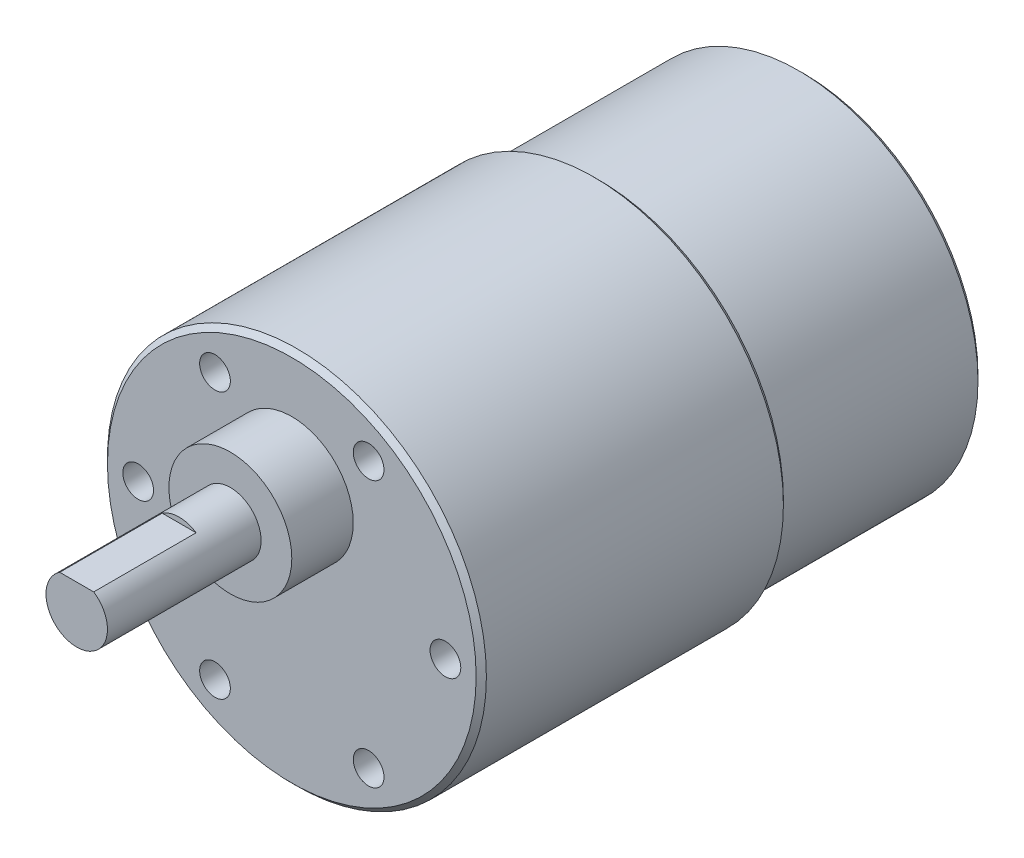
ISO-10303-21;
HEADER;
FILE_DESCRIPTION(('STEP AP214'),'2;1');
FILE_NAME('part.step','',(''),(''),'','','');
FILE_SCHEMA(('AUTOMOTIVE_DESIGN { 1 0 10303 214 1 1 1 1 }'));
ENDSEC;
DATA;
#1=APPLICATION_CONTEXT('core data for automotive mechanical design processes');
#2=APPLICATION_PROTOCOL_DEFINITION('international standard','automotive_design',2000,#1);
#3=PRODUCT_CONTEXT('',#1,'mechanical');
#4=PRODUCT('Part','Part','',(#3));
#5=PRODUCT_RELATED_PRODUCT_CATEGORY('part','',(#4));
#6=PRODUCT_DEFINITION_FORMATION('','',#4);
#7=PRODUCT_DEFINITION_CONTEXT('part definition',#1,'design');
#8=PRODUCT_DEFINITION('design','',#6,#7);
#9=PRODUCT_DEFINITION_SHAPE('','',#8);
#10=(LENGTH_UNIT() NAMED_UNIT(*) SI_UNIT(.MILLI.,.METRE.));
#11=(NAMED_UNIT(*) PLANE_ANGLE_UNIT() SI_UNIT($,.RADIAN.));
#12=(NAMED_UNIT(*) SI_UNIT($,.STERADIAN.) SOLID_ANGLE_UNIT());
#13=UNCERTAINTY_MEASURE_WITH_UNIT(LENGTH_MEASURE(1.E-05),#10,'distance_accuracy_value','');
#14=(GEOMETRIC_REPRESENTATION_CONTEXT(3) GLOBAL_UNCERTAINTY_ASSIGNED_CONTEXT((#13)) GLOBAL_UNIT_ASSIGNED_CONTEXT((#10,
#11,#12)) REPRESENTATION_CONTEXT('',''));
#15=CARTESIAN_POINT('',(0.,0.,0.));
#16=DIRECTION('',(0.,0.,1.));
#17=DIRECTION('',(1.,0.,0.));
#18=AXIS2_PLACEMENT_3D('',#15,#16,#17);
#19=CARTESIAN_POINT('',(0.,0.,-50.));
#20=DIRECTION('',(0.,0.,1.));
#21=DIRECTION('',(1.,0.,0.));
#22=AXIS2_PLACEMENT_3D('',#19,#20,#21);
#23=CYLINDRICAL_SURFACE('',#22,18.5);
#24=CARTESIAN_POINT('',(0.,0.,-29.5));
#25=DIRECTION('',(0.,0.,1.));
#26=DIRECTION('',(1.,0.,0.));
#27=AXIS2_PLACEMENT_3D('',#24,#25,#26);
#28=CIRCLE('',#27,18.5);
#29=CARTESIAN_POINT('',(18.5,0.,-29.5));
#30=VERTEX_POINT('',#29);
#31=EDGE_CURVE('E111',#30,#30,#28,.T.);
#32=ORIENTED_EDGE('',*,*,#31,.T.);
#33=EDGE_LOOP('',(#32));
#34=FACE_BOUND('',#33,.T.);
#35=CARTESIAN_POINT('',(0.,0.,-0.499999999999994));
#36=DIRECTION('',(0.,0.,1.));
#37=DIRECTION('',(1.,0.,0.));
#38=AXIS2_PLACEMENT_3D('',#35,#36,#37);
#39=CIRCLE('',#38,18.5);
#40=CARTESIAN_POINT('',(18.5,0.,-0.499999999999994));
#41=VERTEX_POINT('',#40);
#42=EDGE_CURVE('E108',#41,#41,#39,.F.);
#43=ORIENTED_EDGE('',*,*,#42,.T.);
#44=EDGE_LOOP('',(#43));
#45=FACE_BOUND('',#44,.T.);
#46=ADVANCED_FACE('F47',(#34,#45),#23,.T.);
#47=CARTESIAN_POINT('',(0.,0.,0.));
#48=DIRECTION('',(0.,0.,1.));
#49=DIRECTION('',(1.,0.,0.));
#50=AXIS2_PLACEMENT_3D('',#47,#48,#49);
#51=PLANE('',#50);
#52=CARTESIAN_POINT('',(15.,0.,0.));
#53=DIRECTION('',(0.,0.,1.));
#54=DIRECTION('',(1.,0.,0.));
#55=AXIS2_PLACEMENT_3D('',#52,#53,#54);
#56=CIRCLE('',#55,1.5);
#57=CARTESIAN_POINT('',(16.5,0.,0.));
#58=VERTEX_POINT('',#57);
#59=EDGE_CURVE('E258',#58,#58,#56,.T.);
#60=ORIENTED_EDGE('',*,*,#59,.F.);
#61=EDGE_LOOP('',(#60));
#62=FACE_BOUND('',#61,.T.);
#63=CARTESIAN_POINT('',(7.49999999999999,12.9903810567666,0.));
#64=DIRECTION('',(0.,0.,1.));
#65=DIRECTION('',(1.,0.,0.));
#66=AXIS2_PLACEMENT_3D('',#63,#64,#65);
#67=CIRCLE('',#66,1.5);
#68=CARTESIAN_POINT('',(8.99999999999999,12.9903810567666,0.));
#69=VERTEX_POINT('',#68);
#70=EDGE_CURVE('E268',#69,#69,#67,.T.);
#71=ORIENTED_EDGE('',*,*,#70,.F.);
#72=EDGE_LOOP('',(#71));
#73=FACE_BOUND('',#72,.T.);
#74=CARTESIAN_POINT('',(-7.50000000000001,12.9903810567666,0.));
#75=DIRECTION('',(0.,0.,1.));
#76=DIRECTION('',(1.,0.,0.));
#77=AXIS2_PLACEMENT_3D('',#74,#75,#76);
#78=CIRCLE('',#77,1.5);
#79=CARTESIAN_POINT('',(-6.00000000000001,12.9903810567666,0.));
#80=VERTEX_POINT('',#79);
#81=EDGE_CURVE('E267',#80,#80,#78,.T.);
#82=ORIENTED_EDGE('',*,*,#81,.F.);
#83=EDGE_LOOP('',(#82));
#84=FACE_BOUND('',#83,.T.);
#85=CARTESIAN_POINT('',(-15.,0.,0.));
#86=DIRECTION('',(0.,0.,1.));
#87=DIRECTION('',(1.,0.,0.));
#88=AXIS2_PLACEMENT_3D('',#85,#86,#87);
#89=CIRCLE('',#88,1.5);
#90=CARTESIAN_POINT('',(-13.5,0.,0.));
#91=VERTEX_POINT('',#90);
#92=EDGE_CURVE('E285',#91,#91,#89,.T.);
#93=ORIENTED_EDGE('',*,*,#92,.F.);
#94=EDGE_LOOP('',(#93));
#95=FACE_BOUND('',#94,.T.);
#96=CARTESIAN_POINT('',(-7.5,-12.9903810567666,0.));
#97=DIRECTION('',(0.,0.,1.));
#98=DIRECTION('',(1.,0.,0.));
#99=AXIS2_PLACEMENT_3D('',#96,#97,#98);
#100=CIRCLE('',#99,1.5);
#101=CARTESIAN_POINT('',(-5.99999999999999,-12.9903810567666,0.));
#102=VERTEX_POINT('',#101);
#103=EDGE_CURVE('E279',#102,#102,#100,.T.);
#104=ORIENTED_EDGE('',*,*,#103,.F.);
#105=EDGE_LOOP('',(#104));
#106=FACE_BOUND('',#105,.T.);
#107=CARTESIAN_POINT('',(7.5,-12.9903810567666,0.));
#108=DIRECTION('',(0.,0.,1.));
#109=DIRECTION('',(1.,0.,0.));
#110=AXIS2_PLACEMENT_3D('',#107,#108,#109);
#111=CIRCLE('',#110,1.5);
#112=CARTESIAN_POINT('',(9.00000000000001,-12.9903810567666,0.));
#113=VERTEX_POINT('',#112);
#114=EDGE_CURVE('E273',#113,#113,#111,.T.);
#115=ORIENTED_EDGE('',*,*,#114,.F.);
#116=EDGE_LOOP('',(#115));
#117=FACE_BOUND('',#116,.T.);
#118=CARTESIAN_POINT('',(0.,0.,0.));
#119=DIRECTION('',(0.,0.,1.));
#120=DIRECTION('',(1.,0.,0.));
#121=AXIS2_PLACEMENT_3D('',#118,#119,#120);
#122=CIRCLE('',#121,18.);
#123=CARTESIAN_POINT('',(18.,0.,0.));
#124=VERTEX_POINT('',#123);
#125=EDGE_CURVE('E12',#124,#124,#122,.T.);
#126=ORIENTED_EDGE('',*,*,#125,.T.);
#127=EDGE_LOOP('',(#126));
#128=FACE_BOUND('',#127,.T.);
#129=CARTESIAN_POINT('',(0.,7.,0.));
#130=DIRECTION('',(0.,0.,1.));
#131=DIRECTION('',(1.,0.,0.));
#132=AXIS2_PLACEMENT_3D('',#129,#130,#131);
#133=CIRCLE('',#132,6.);
#134=CARTESIAN_POINT('',(6.,7.,0.));
#135=VERTEX_POINT('',#134);
#136=EDGE_CURVE('E143',#135,#135,#133,.T.);
#137=ORIENTED_EDGE('',*,*,#136,.F.);
#138=EDGE_LOOP('',(#137));
#139=FACE_BOUND('',#138,.T.);
#140=ADVANCED_FACE('F127',(#62,#73,#84,#95,#106,#117,#128,#139),#51,.T.);
#141=CARTESIAN_POINT('',(0.,7.,6.));
#142=DIRECTION('',(0.,0.,-1.));
#143=DIRECTION('',(-1.,0.,0.));
#144=AXIS2_PLACEMENT_3D('',#141,#142,#143);
#145=CYLINDRICAL_SURFACE('',#144,6.);
#146=CARTESIAN_POINT('',(0.,7.,6.));
#147=DIRECTION('',(0.,0.,1.));
#148=DIRECTION('',(1.,0.,0.));
#149=AXIS2_PLACEMENT_3D('',#146,#147,#148);
#150=CIRCLE('',#149,6.);
#151=CARTESIAN_POINT('',(6.,7.,6.));
#152=VERTEX_POINT('',#151);
#153=EDGE_CURVE('E96',#152,#152,#150,.T.);
#154=ORIENTED_EDGE('',*,*,#153,.F.);
#155=EDGE_LOOP('',(#154));
#156=FACE_BOUND('',#155,.T.);
#157=ORIENTED_EDGE('',*,*,#136,.T.);
#158=EDGE_LOOP('',(#157));
#159=FACE_BOUND('',#158,.T.);
#160=ADVANCED_FACE('F138',(#156,#159),#145,.T.);
#161=CARTESIAN_POINT('',(0.,7.,6.));
#162=DIRECTION('',(0.,0.,1.));
#163=DIRECTION('',(1.,0.,0.));
#164=AXIS2_PLACEMENT_3D('',#161,#162,#163);
#165=PLANE('',#164);
#166=CARTESIAN_POINT('',(0.,7.,6.));
#167=DIRECTION('',(0.,0.,1.));
#168=DIRECTION('',(1.,0.,0.));
#169=AXIS2_PLACEMENT_3D('',#166,#167,#168);
#170=CIRCLE('',#169,3.);
#171=CARTESIAN_POINT('',(3.,7.,6.));
#172=VERTEX_POINT('',#171);
#173=EDGE_CURVE('E79',#172,#172,#170,.T.);
#174=ORIENTED_EDGE('',*,*,#173,.F.);
#175=EDGE_LOOP('',(#174));
#176=FACE_BOUND('',#175,.T.);
#177=ORIENTED_EDGE('',*,*,#153,.T.);
#178=EDGE_LOOP('',(#177));
#179=FACE_BOUND('',#178,.T.);
#180=ADVANCED_FACE('F158',(#176,#179),#165,.T.);
#181=CARTESIAN_POINT('',(0.,0.,11.));
#182=DIRECTION('',(0.,0.,1.));
#183=DIRECTION('',(1.,0.,0.));
#184=AXIS2_PLACEMENT_3D('',#181,#182,#183);
#185=PLANE('',#184);
#186=CARTESIAN_POINT('',(0.,7.,11.));
#187=DIRECTION('',(0.,0.,1.));
#188=DIRECTION('',(1.,0.,0.));
#189=AXIS2_PLACEMENT_3D('',#186,#187,#188);
#190=CIRCLE('',#189,3.);
#191=CARTESIAN_POINT('',(1.6583123951777,9.5,11.));
#192=VERTEX_POINT('',#191);
#193=CARTESIAN_POINT('',(-1.6583123951777,9.5,11.));
#194=VERTEX_POINT('',#193);
#195=EDGE_CURVE('E78',#192,#194,#190,.T.);
#196=ORIENTED_EDGE('',*,*,#195,.T.);
#197=DIRECTION('',(1.,0.,0.));
#198=VECTOR('',#197,1.);
#199=CARTESIAN_POINT('',(0.,9.5,11.));
#200=LINE('',#199,#198);
#201=EDGE_CURVE('E154',#194,#192,#200,.T.);
#202=ORIENTED_EDGE('',*,*,#201,.T.);
#203=EDGE_LOOP('',(#196,#202));
#204=FACE_BOUND('',#203,.T.);
#205=ADVANCED_FACE('F156',(#204),#185,.T.);
#206=CARTESIAN_POINT('',(0.,9.5,11.));
#207=DIRECTION('',(0.,-1.,0.));
#208=DIRECTION('',(0.,0.,-1.));
#209=AXIS2_PLACEMENT_3D('',#206,#207,#208);
#210=PLANE('',#209);
#211=DIRECTION('',(1.,0.,0.));
#212=VECTOR('',#211,1.);
#213=CARTESIAN_POINT('',(0.,9.5,21.));
#214=LINE('',#213,#212);
#215=CARTESIAN_POINT('',(-1.6583123951777,9.5,21.));
#216=VERTEX_POINT('',#215);
#217=CARTESIAN_POINT('',(1.6583123951777,9.5,21.));
#218=VERTEX_POINT('',#217);
#219=EDGE_CURVE('E73',#216,#218,#214,.T.);
#220=ORIENTED_EDGE('',*,*,#219,.T.);
#221=DIRECTION('',(0.,0.,1.));
#222=VECTOR('',#221,1.);
#223=CARTESIAN_POINT('',(1.6583123951777,9.5,11.));
#224=LINE('',#223,#222);
#225=EDGE_CURVE('E68',#192,#218,#224,.T.);
#226=ORIENTED_EDGE('',*,*,#225,.F.);
#227=ORIENTED_EDGE('',*,*,#201,.F.);
#228=DIRECTION('',(0.,0.,1.));
#229=VECTOR('',#228,1.);
#230=CARTESIAN_POINT('',(-1.6583123951777,9.5,11.));
#231=LINE('',#230,#229);
#232=EDGE_CURVE('E62',#194,#216,#231,.T.);
#233=ORIENTED_EDGE('',*,*,#232,.T.);
#234=EDGE_LOOP('',(#220,#226,#227,#233));
#235=FACE_BOUND('',#234,.T.);
#236=ADVANCED_FACE('F74',(#235),#210,.F.);
#237=CARTESIAN_POINT('',(0.,0.,21.));
#238=DIRECTION('',(0.,0.,1.));
#239=DIRECTION('',(1.,0.,0.));
#240=AXIS2_PLACEMENT_3D('',#237,#238,#239);
#241=PLANE('',#240);
#242=ORIENTED_EDGE('',*,*,#219,.F.);
#243=CARTESIAN_POINT('',(0.,7.,21.));
#244=DIRECTION('',(0.,0.,1.));
#245=DIRECTION('',(1.,0.,0.));
#246=AXIS2_PLACEMENT_3D('',#243,#244,#245);
#247=CIRCLE('',#246,3.);
#248=EDGE_CURVE('E84',#216,#218,#247,.T.);
#249=ORIENTED_EDGE('',*,*,#248,.T.);
#250=EDGE_LOOP('',(#242,#249));
#251=FACE_BOUND('',#250,.T.);
#252=ADVANCED_FACE('F86',(#251),#241,.T.);
#253=CARTESIAN_POINT('',(0.,7.,21.));
#254=DIRECTION('',(0.,0.,-1.));
#255=DIRECTION('',(-1.,0.,0.));
#256=AXIS2_PLACEMENT_3D('',#253,#254,#255);
#257=CYLINDRICAL_SURFACE('',#256,3.);
#258=ORIENTED_EDGE('',*,*,#173,.T.);
#259=EDGE_LOOP('',(#258));
#260=FACE_BOUND('',#259,.T.);
#261=ORIENTED_EDGE('',*,*,#248,.F.);
#262=ORIENTED_EDGE('',*,*,#232,.F.);
#263=ORIENTED_EDGE('',*,*,#195,.F.);
#264=ORIENTED_EDGE('',*,*,#225,.T.);
#265=EDGE_LOOP('',(#261,#262,#263,#264));
#266=FACE_BOUND('',#265,.T.);
#267=ADVANCED_FACE('F83',(#260,#266),#257,.T.);
#268=CARTESIAN_POINT('',(0.,0.,-30.));
#269=DIRECTION('',(0.,0.,1.));
#270=DIRECTION('',(1.,0.,0.));
#271=AXIS2_PLACEMENT_3D('',#268,#269,#270);
#272=PLANE('',#271);
#273=CARTESIAN_POINT('',(0.,0.,-30.));
#274=DIRECTION('',(0.,0.,1.));
#275=DIRECTION('',(1.,0.,0.));
#276=AXIS2_PLACEMENT_3D('',#273,#274,#275);
#277=CIRCLE('',#276,18.);
#278=CARTESIAN_POINT('',(18.,0.,-30.));
#279=VERTEX_POINT('',#278);
#280=EDGE_CURVE('E55',#279,#279,#277,.F.);
#281=ORIENTED_EDGE('',*,*,#280,.T.);
#282=EDGE_LOOP('',(#281));
#283=FACE_BOUND('',#282,.T.);
#284=CARTESIAN_POINT('',(0.,0.,-30.));
#285=DIRECTION('',(0.,0.,1.));
#286=DIRECTION('',(1.,0.,0.));
#287=AXIS2_PLACEMENT_3D('',#284,#285,#286);
#288=CIRCLE('',#287,17.5);
#289=CARTESIAN_POINT('',(17.5,0.,-30.));
#290=VERTEX_POINT('',#289);
#291=EDGE_CURVE('E145',#290,#290,#288,.T.);
#292=ORIENTED_EDGE('',*,*,#291,.T.);
#293=EDGE_LOOP('',(#292));
#294=FACE_BOUND('',#293,.T.);
#295=ADVANCED_FACE('F116',(#283,#294),#272,.F.);
#296=CARTESIAN_POINT('',(0.,0.,-30.));
#297=DIRECTION('',(0.,0.,-1.));
#298=DIRECTION('',(-1.,0.,0.));
#299=AXIS2_PLACEMENT_3D('',#296,#297,#298);
#300=CYLINDRICAL_SURFACE('',#299,17.5);
#301=CARTESIAN_POINT('',(0.,0.,-49.5));
#302=DIRECTION('',(0.,0.,1.));
#303=DIRECTION('',(1.,0.,0.));
#304=AXIS2_PLACEMENT_3D('',#301,#302,#303);
#305=CIRCLE('',#304,17.5);
#306=CARTESIAN_POINT('',(17.5,0.,-49.5));
#307=VERTEX_POINT('',#306);
#308=EDGE_CURVE('E102',#307,#307,#305,.T.);
#309=ORIENTED_EDGE('',*,*,#308,.T.);
#310=EDGE_LOOP('',(#309));
#311=FACE_BOUND('',#310,.T.);
#312=ORIENTED_EDGE('',*,*,#291,.F.);
#313=EDGE_LOOP('',(#312));
#314=FACE_BOUND('',#313,.T.);
#315=ADVANCED_FACE('F178',(#311,#314),#300,.T.);
#316=CARTESIAN_POINT('',(0.,0.,-56.));
#317=DIRECTION('',(0.,0.,-1.));
#318=DIRECTION('',(-1.,0.,0.));
#319=AXIS2_PLACEMENT_3D('',#316,#317,#318);
#320=PLANE('',#319);
#321=CARTESIAN_POINT('',(0.,0.,-56.));
#322=DIRECTION('',(0.,0.,-1.));
#323=DIRECTION('',(-1.,0.,0.));
#324=AXIS2_PLACEMENT_3D('',#321,#322,#323);
#325=CIRCLE('',#324,4.50000000000002);
#326=CARTESIAN_POINT('',(-4.50000000000002,0.,-56.));
#327=VERTEX_POINT('',#326);
#328=EDGE_CURVE('E90',#327,#327,#325,.T.);
#329=ORIENTED_EDGE('',*,*,#328,.T.);
#330=EDGE_LOOP('',(#329));
#331=FACE_BOUND('',#330,.T.);
#332=ADVANCED_FACE('F174',(#331),#320,.T.);
#333=CARTESIAN_POINT('',(0.,0.,-56.));
#334=DIRECTION('',(0.,0.,1.));
#335=DIRECTION('',(1.,0.,0.));
#336=AXIS2_PLACEMENT_3D('',#333,#334,#335);
#337=CYLINDRICAL_SURFACE('',#336,5.);
#338=CARTESIAN_POINT('',(0.,0.,-55.5));
#339=DIRECTION('',(0.,0.,-1.));
#340=DIRECTION('',(-1.,0.,0.));
#341=AXIS2_PLACEMENT_3D('',#338,#339,#340);
#342=CIRCLE('',#341,5.);
#343=CARTESIAN_POINT('',(-5.,0.,-55.5));
#344=VERTEX_POINT('',#343);
#345=EDGE_CURVE('E99',#344,#344,#342,.F.);
#346=ORIENTED_EDGE('',*,*,#345,.T.);
#347=EDGE_LOOP('',(#346));
#348=FACE_BOUND('',#347,.T.);
#349=CARTESIAN_POINT('',(0.,0.,-50.));
#350=DIRECTION('',(0.,0.,-1.));
#351=DIRECTION('',(-1.,0.,0.));
#352=AXIS2_PLACEMENT_3D('',#349,#350,#351);
#353=CIRCLE('',#352,5.);
#354=CARTESIAN_POINT('',(-5.,0.,-50.));
#355=VERTEX_POINT('',#354);
#356=EDGE_CURVE('E87',#355,#355,#353,.T.);
#357=ORIENTED_EDGE('',*,*,#356,.T.);
#358=EDGE_LOOP('',(#357));
#359=FACE_BOUND('',#358,.T.);
#360=ADVANCED_FACE('F177',(#348,#359),#337,.T.);
#361=CARTESIAN_POINT('',(0.,0.,-50.));
#362=DIRECTION('',(0.,0.,1.));
#363=DIRECTION('',(1.,0.,0.));
#364=AXIS2_PLACEMENT_3D('',#361,#362,#363);
#365=PLANE('',#364);
#366=CARTESIAN_POINT('',(0.,0.,-50.));
#367=DIRECTION('',(0.,0.,1.));
#368=DIRECTION('',(1.,0.,0.));
#369=AXIS2_PLACEMENT_3D('',#366,#367,#368);
#370=CIRCLE('',#369,17.);
#371=CARTESIAN_POINT('',(17.,0.,-50.));
#372=VERTEX_POINT('',#371);
#373=EDGE_CURVE('E105',#372,#372,#370,.F.);
#374=ORIENTED_EDGE('',*,*,#373,.T.);
#375=EDGE_LOOP('',(#374));
#376=FACE_BOUND('',#375,.T.);
#377=ORIENTED_EDGE('',*,*,#356,.F.);
#378=EDGE_LOOP('',(#377));
#379=FACE_BOUND('',#378,.T.);
#380=ADVANCED_FACE('F182',(#376,#379),#365,.F.);
#381=CARTESIAN_POINT('',(0.,0.,-56.));
#382=DIRECTION('',(0.,0.,1.));
#383=DIRECTION('',(1.,0.,0.));
#384=AXIS2_PLACEMENT_3D('',#381,#382,#383);
#385=CONICAL_SURFACE('',#384,4.50000000000002,0.785398163397444);
#386=ORIENTED_EDGE('',*,*,#345,.F.);
#387=EDGE_LOOP('',(#386));
#388=FACE_BOUND('',#387,.T.);
#389=ORIENTED_EDGE('',*,*,#328,.F.);
#390=EDGE_LOOP('',(#389));
#391=FACE_BOUND('',#390,.T.);
#392=ADVANCED_FACE('F185',(#388,#391),#385,.T.);
#393=CARTESIAN_POINT('',(0.,0.,-49.5));
#394=DIRECTION('',(0.,0.,1.));
#395=DIRECTION('',(1.,0.,0.));
#396=AXIS2_PLACEMENT_3D('',#393,#394,#395);
#397=CONICAL_SURFACE('',#396,17.5,0.785398163397452);
#398=ORIENTED_EDGE('',*,*,#373,.F.);
#399=EDGE_LOOP('',(#398));
#400=FACE_BOUND('',#399,.T.);
#401=ORIENTED_EDGE('',*,*,#308,.F.);
#402=EDGE_LOOP('',(#401));
#403=FACE_BOUND('',#402,.T.);
#404=ADVANCED_FACE('F122',(#400,#403),#397,.T.);
#405=CARTESIAN_POINT('',(0.,0.,-29.5));
#406=DIRECTION('',(0.,0.,1.));
#407=DIRECTION('',(1.,0.,0.));
#408=AXIS2_PLACEMENT_3D('',#405,#406,#407);
#409=CONICAL_SURFACE('',#408,18.5,0.785398163397459);
#410=ORIENTED_EDGE('',*,*,#280,.F.);
#411=EDGE_LOOP('',(#410));
#412=FACE_BOUND('',#411,.T.);
#413=ORIENTED_EDGE('',*,*,#31,.F.);
#414=EDGE_LOOP('',(#413));
#415=FACE_BOUND('',#414,.T.);
#416=ADVANCED_FACE('F119',(#412,#415),#409,.T.);
#417=CARTESIAN_POINT('',(0.,0.,0.));
#418=DIRECTION('',(0.,0.,-1.));
#419=DIRECTION('',(-1.,0.,0.));
#420=AXIS2_PLACEMENT_3D('',#417,#418,#419);
#421=CONICAL_SURFACE('',#420,18.,0.785398163397424);
#422=ORIENTED_EDGE('',*,*,#42,.F.);
#423=EDGE_LOOP('',(#422));
#424=FACE_BOUND('',#423,.T.);
#425=ORIENTED_EDGE('',*,*,#125,.F.);
#426=EDGE_LOOP('',(#425));
#427=FACE_BOUND('',#426,.T.);
#428=ADVANCED_FACE('F49',(#424,#427),#421,.T.);
#429=CARTESIAN_POINT('',(7.5,-12.9903810567666,-10.));
#430=DIRECTION('',(0.,0.,1.));
#431=DIRECTION('',(1.,0.,0.));
#432=AXIS2_PLACEMENT_3D('',#429,#430,#431);
#433=CYLINDRICAL_SURFACE('',#432,1.5);
#434=CARTESIAN_POINT('',(7.5,-12.9903810567666,-10.));
#435=DIRECTION('',(0.,0.,1.));
#436=DIRECTION('',(1.,0.,0.));
#437=AXIS2_PLACEMENT_3D('',#434,#435,#436);
#438=CIRCLE('',#437,1.5);
#439=CARTESIAN_POINT('',(9.00000000000001,-12.9903810567666,-10.));
#440=VERTEX_POINT('',#439);
#441=EDGE_CURVE('E261',#440,#440,#438,.T.);
#442=ORIENTED_EDGE('',*,*,#441,.F.);
#443=EDGE_LOOP('',(#442));
#444=FACE_BOUND('',#443,.T.);
#445=ORIENTED_EDGE('',*,*,#114,.T.);
#446=EDGE_LOOP('',(#445));
#447=FACE_BOUND('',#446,.T.);
#448=ADVANCED_FACE('F133',(#444,#447),#433,.F.);
#449=CARTESIAN_POINT('',(7.5,-12.9903810567666,-10.));
#450=DIRECTION('',(0.,0.,1.));
#451=DIRECTION('',(1.,0.,0.));
#452=AXIS2_PLACEMENT_3D('',#449,#450,#451);
#453=PLANE('',#452);
#454=ORIENTED_EDGE('',*,*,#441,.T.);
#455=EDGE_LOOP('',(#454));
#456=FACE_BOUND('',#455,.T.);
#457=ADVANCED_FACE('F229',(#456),#453,.T.);
#458=CARTESIAN_POINT('',(-7.5,-12.9903810567666,-10.));
#459=DIRECTION('',(0.,0.,1.));
#460=DIRECTION('',(1.,0.,0.));
#461=AXIS2_PLACEMENT_3D('',#458,#459,#460);
#462=CYLINDRICAL_SURFACE('',#461,1.5);
#463=CARTESIAN_POINT('',(-7.5,-12.9903810567666,-10.));
#464=DIRECTION('',(0.,0.,1.));
#465=DIRECTION('',(1.,0.,0.));
#466=AXIS2_PLACEMENT_3D('',#463,#464,#465);
#467=CIRCLE('',#466,1.5);
#468=CARTESIAN_POINT('',(-5.99999999999999,-12.9903810567666,-10.));
#469=VERTEX_POINT('',#468);
#470=EDGE_CURVE('E276',#469,#469,#467,.T.);
#471=ORIENTED_EDGE('',*,*,#470,.F.);
#472=EDGE_LOOP('',(#471));
#473=FACE_BOUND('',#472,.T.);
#474=ORIENTED_EDGE('',*,*,#103,.T.);
#475=EDGE_LOOP('',(#474));
#476=FACE_BOUND('',#475,.T.);
#477=ADVANCED_FACE('F226',(#473,#476),#462,.F.);
#478=CARTESIAN_POINT('',(-7.5,-12.9903810567666,-10.));
#479=DIRECTION('',(0.,0.,1.));
#480=DIRECTION('',(1.,0.,0.));
#481=AXIS2_PLACEMENT_3D('',#478,#479,#480);
#482=PLANE('',#481);
#483=ORIENTED_EDGE('',*,*,#470,.T.);
#484=EDGE_LOOP('',(#483));
#485=FACE_BOUND('',#484,.T.);
#486=ADVANCED_FACE('F221',(#485),#482,.T.);
#487=CARTESIAN_POINT('',(-15.,0.,-10.));
#488=DIRECTION('',(0.,0.,1.));
#489=DIRECTION('',(1.,0.,0.));
#490=AXIS2_PLACEMENT_3D('',#487,#488,#489);
#491=CYLINDRICAL_SURFACE('',#490,1.5);
#492=CARTESIAN_POINT('',(-15.,0.,-10.));
#493=DIRECTION('',(0.,0.,1.));
#494=DIRECTION('',(1.,0.,0.));
#495=AXIS2_PLACEMENT_3D('',#492,#493,#494);
#496=CIRCLE('',#495,1.5);
#497=CARTESIAN_POINT('',(-13.5,0.,-10.));
#498=VERTEX_POINT('',#497);
#499=EDGE_CURVE('E282',#498,#498,#496,.T.);
#500=ORIENTED_EDGE('',*,*,#499,.F.);
#501=EDGE_LOOP('',(#500));
#502=FACE_BOUND('',#501,.T.);
#503=ORIENTED_EDGE('',*,*,#92,.T.);
#504=EDGE_LOOP('',(#503));
#505=FACE_BOUND('',#504,.T.);
#506=ADVANCED_FACE('F218',(#502,#505),#491,.F.);
#507=CARTESIAN_POINT('',(-15.,0.,-10.));
#508=DIRECTION('',(0.,0.,1.));
#509=DIRECTION('',(1.,0.,0.));
#510=AXIS2_PLACEMENT_3D('',#507,#508,#509);
#511=PLANE('',#510);
#512=ORIENTED_EDGE('',*,*,#499,.T.);
#513=EDGE_LOOP('',(#512));
#514=FACE_BOUND('',#513,.T.);
#515=ADVANCED_FACE('F212',(#514),#511,.T.);
#516=CARTESIAN_POINT('',(-7.50000000000001,12.9903810567666,-10.));
#517=DIRECTION('',(0.,0.,1.));
#518=DIRECTION('',(1.,0.,0.));
#519=AXIS2_PLACEMENT_3D('',#516,#517,#518);
#520=CYLINDRICAL_SURFACE('',#519,1.5);
#521=CARTESIAN_POINT('',(-7.50000000000001,12.9903810567666,-10.));
#522=DIRECTION('',(0.,0.,1.));
#523=DIRECTION('',(1.,0.,0.));
#524=AXIS2_PLACEMENT_3D('',#521,#522,#523);
#525=CIRCLE('',#524,1.5);
#526=CARTESIAN_POINT('',(-6.00000000000001,12.9903810567666,-10.));
#527=VERTEX_POINT('',#526);
#528=EDGE_CURVE('E288',#527,#527,#525,.T.);
#529=ORIENTED_EDGE('',*,*,#528,.F.);
#530=EDGE_LOOP('',(#529));
#531=FACE_BOUND('',#530,.T.);
#532=ORIENTED_EDGE('',*,*,#81,.T.);
#533=EDGE_LOOP('',(#532));
#534=FACE_BOUND('',#533,.T.);
#535=ADVANCED_FACE('F208',(#531,#534),#520,.F.);
#536=CARTESIAN_POINT('',(-7.50000000000001,12.9903810567666,-10.));
#537=DIRECTION('',(0.,0.,1.));
#538=DIRECTION('',(1.,0.,0.));
#539=AXIS2_PLACEMENT_3D('',#536,#537,#538);
#540=PLANE('',#539);
#541=ORIENTED_EDGE('',*,*,#528,.T.);
#542=EDGE_LOOP('',(#541));
#543=FACE_BOUND('',#542,.T.);
#544=ADVANCED_FACE('F211',(#543),#540,.T.);
#545=CARTESIAN_POINT('',(7.49999999999999,12.9903810567666,-10.));
#546=DIRECTION('',(0.,0.,1.));
#547=DIRECTION('',(1.,0.,0.));
#548=AXIS2_PLACEMENT_3D('',#545,#546,#547);
#549=CYLINDRICAL_SURFACE('',#548,1.5);
#550=CARTESIAN_POINT('',(7.49999999999999,12.9903810567666,-10.));
#551=DIRECTION('',(0.,0.,1.));
#552=DIRECTION('',(1.,0.,0.));
#553=AXIS2_PLACEMENT_3D('',#550,#551,#552);
#554=CIRCLE('',#553,1.5);
#555=CARTESIAN_POINT('',(8.99999999999999,12.9903810567666,-10.));
#556=VERTEX_POINT('',#555);
#557=EDGE_CURVE('E264',#556,#556,#554,.T.);
#558=ORIENTED_EDGE('',*,*,#557,.F.);
#559=EDGE_LOOP('',(#558));
#560=FACE_BOUND('',#559,.T.);
#561=ORIENTED_EDGE('',*,*,#70,.T.);
#562=EDGE_LOOP('',(#561));
#563=FACE_BOUND('',#562,.T.);
#564=ADVANCED_FACE('F216',(#560,#563),#549,.F.);
#565=CARTESIAN_POINT('',(7.49999999999999,12.9903810567666,-10.));
#566=DIRECTION('',(0.,0.,1.));
#567=DIRECTION('',(1.,0.,0.));
#568=AXIS2_PLACEMENT_3D('',#565,#566,#567);
#569=PLANE('',#568);
#570=ORIENTED_EDGE('',*,*,#557,.T.);
#571=EDGE_LOOP('',(#570));
#572=FACE_BOUND('',#571,.T.);
#573=ADVANCED_FACE('F242',(#572),#569,.T.);
#574=CARTESIAN_POINT('',(15.,0.,-10.));
#575=DIRECTION('',(0.,0.,1.));
#576=DIRECTION('',(1.,0.,0.));
#577=AXIS2_PLACEMENT_3D('',#574,#575,#576);
#578=CYLINDRICAL_SURFACE('',#577,1.5);
#579=CARTESIAN_POINT('',(15.,0.,-10.));
#580=DIRECTION('',(0.,0.,1.));
#581=DIRECTION('',(1.,0.,0.));
#582=AXIS2_PLACEMENT_3D('',#579,#580,#581);
#583=CIRCLE('',#582,1.5);
#584=CARTESIAN_POINT('',(16.5,0.,-10.));
#585=VERTEX_POINT('',#584);
#586=EDGE_CURVE('E150',#585,#585,#583,.T.);
#587=ORIENTED_EDGE('',*,*,#586,.F.);
#588=EDGE_LOOP('',(#587));
#589=FACE_BOUND('',#588,.T.);
#590=ORIENTED_EDGE('',*,*,#59,.T.);
#591=EDGE_LOOP('',(#590));
#592=FACE_BOUND('',#591,.T.);
#593=ADVANCED_FACE('F246',(#589,#592),#578,.F.);
#594=CARTESIAN_POINT('',(15.,0.,-10.));
#595=DIRECTION('',(0.,0.,1.));
#596=DIRECTION('',(1.,0.,0.));
#597=AXIS2_PLACEMENT_3D('',#594,#595,#596);
#598=PLANE('',#597);
#599=ORIENTED_EDGE('',*,*,#586,.T.);
#600=EDGE_LOOP('',(#599));
#601=FACE_BOUND('',#600,.T.);
#602=ADVANCED_FACE('F250',(#601),#598,.T.);
#603=CLOSED_SHELL('',(#46,#140,#160,#180,#205,#236,#252,#267,#295,#315,#332,#360,#380,#392,#404,
#416,#428,#448,#457,#477,#486,#506,#515,#535,#544,#564,#573,#593,#602));
#604=MANIFOLD_SOLID_BREP('B2',#603);
#605=ADVANCED_BREP_SHAPE_REPRESENTATION('',(#18,#604),#14);
#606=SHAPE_DEFINITION_REPRESENTATION(#9,#605);
ENDSEC;
END-ISO-10303-21;
